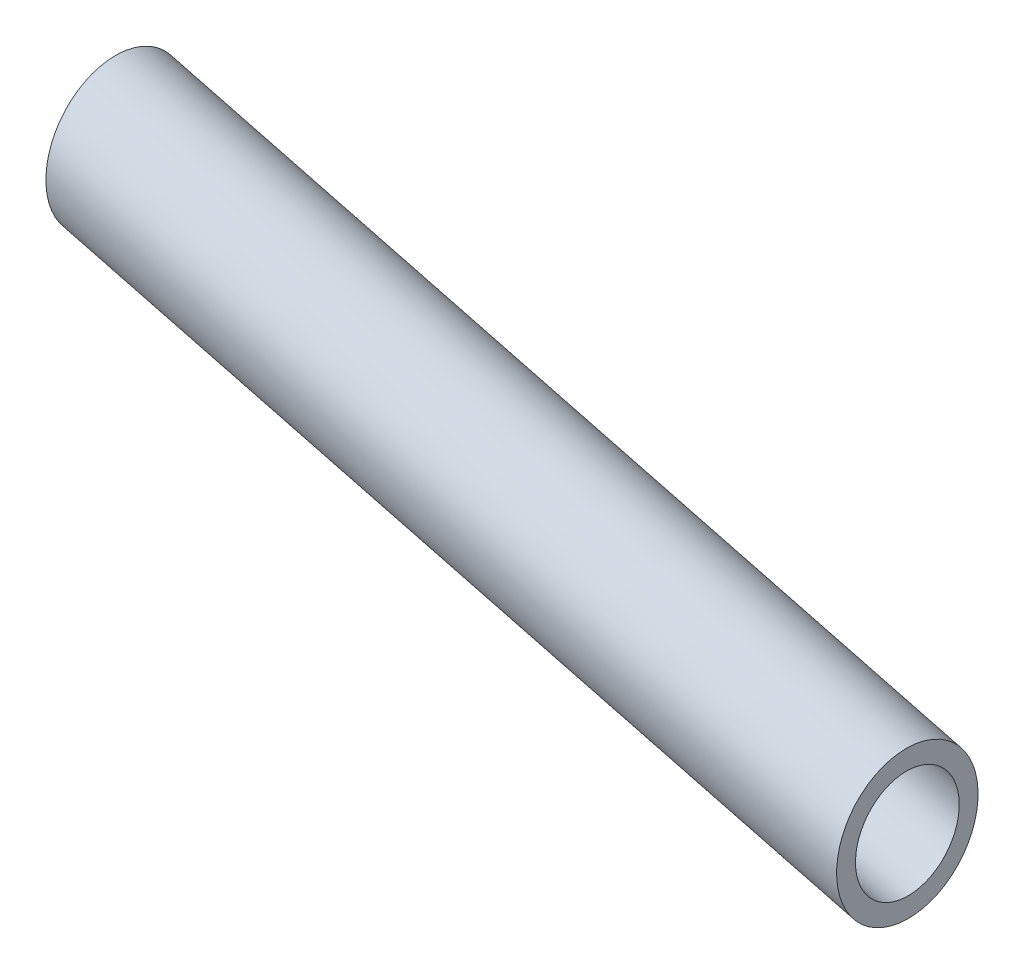
ISO-10303-21;
HEADER;
FILE_DESCRIPTION(('STEP AP214'),'2;1');
FILE_NAME('part.step','',(''),(''),'','','');
FILE_SCHEMA(('AUTOMOTIVE_DESIGN { 1 0 10303 214 1 1 1 1 }'));
ENDSEC;
DATA;
#1=APPLICATION_CONTEXT('core data for automotive mechanical design processes');
#2=APPLICATION_PROTOCOL_DEFINITION('international standard','automotive_design',2000,#1);
#3=PRODUCT_CONTEXT('',#1,'mechanical');
#4=PRODUCT('Part','Part','',(#3));
#5=PRODUCT_RELATED_PRODUCT_CATEGORY('part','',(#4));
#6=PRODUCT_DEFINITION_FORMATION('','',#4);
#7=PRODUCT_DEFINITION_CONTEXT('part definition',#1,'design');
#8=PRODUCT_DEFINITION('design','',#6,#7);
#9=PRODUCT_DEFINITION_SHAPE('','',#8);
#10=(LENGTH_UNIT() NAMED_UNIT(*) SI_UNIT(.MILLI.,.METRE.));
#11=(NAMED_UNIT(*) PLANE_ANGLE_UNIT() SI_UNIT($,.RADIAN.));
#12=(NAMED_UNIT(*) SI_UNIT($,.STERADIAN.) SOLID_ANGLE_UNIT());
#13=UNCERTAINTY_MEASURE_WITH_UNIT(LENGTH_MEASURE(1.E-05),#10,'distance_accuracy_value','');
#14=(GEOMETRIC_REPRESENTATION_CONTEXT(3) GLOBAL_UNCERTAINTY_ASSIGNED_CONTEXT((#13)) GLOBAL_UNIT_ASSIGNED_CONTEXT((#10,
#11,#12)) REPRESENTATION_CONTEXT('',''));
#15=CARTESIAN_POINT('',(0.,0.,0.));
#16=DIRECTION('',(0.,0.,1.));
#17=DIRECTION('',(1.,0.,0.));
#18=AXIS2_PLACEMENT_3D('',#15,#16,#17);
#19=CARTESIAN_POINT('',(20.7,22.164065639471,3.4109850966));
#20=DIRECTION('',(0.951034068730792,-0.305489587315356,-0.0470139570260758));
#21=DIRECTION('',(0.305827761696009,0.95208685537403,0.));
#22=AXIS2_PLACEMENT_3D('',#19,#20,#21);
#23=CYLINDRICAL_SURFACE('',#22,1.65);
#24=DIRECTION('',(0.951034068730915,-0.305489587314972,-0.0470139570260758));
#25=VECTOR('',#24,1.);
#26=CARTESIAN_POINT('',(21.204615806798,23.735008950838,3.4109850966));
#27=LINE('',#26,#25);
#28=CARTESIAN_POINT('',(25.7,22.291009090943,3.18875772723));
#29=VERTEX_POINT('',#28);
#30=CARTESIAN_POINT('',(49.7,14.581768868518,2.002328128413));
#31=VERTEX_POINT('',#30);
#32=EDGE_CURVE('E11',#29,#31,#27,.T.);
#33=ORIENTED_EDGE('',*,*,#32,.F.);
#34=CARTESIAN_POINT('',(25.7,20.557973926466,3.163812263513));
#35=DIRECTION('',(1.,0.,0.));
#36=DIRECTION('',(0.,-0.988364131080042,-0.152106358823007));
#37=AXIS2_PLACEMENT_3D('',#34,#35,#36);
#38=ELLIPSE('',#37,1.734953619697,1.65);
#39=EDGE_CURVE('E28',#29,#29,#38,.T.);
#40=ORIENTED_EDGE('',*,*,#39,.F.);
#41=ORIENTED_EDGE('',*,*,#32,.T.);
#42=CARTESIAN_POINT('',(49.7,12.848733704041,1.977382664695));
#43=DIRECTION('',(1.,0.,0.));
#44=DIRECTION('',(0.,-0.988364131080042,-0.152106358823007));
#45=AXIS2_PLACEMENT_3D('',#42,#43,#44);
#46=ELLIPSE('',#45,1.734953619697,1.65);
#47=EDGE_CURVE('E21',#31,#31,#46,.T.);
#48=ORIENTED_EDGE('',*,*,#47,.T.);
#49=EDGE_LOOP('',(#33,#40,#41,#48));
#50=FACE_BOUND('',#49,.T.);
#51=ADVANCED_FACE('F17',(#50),#23,.F.);
#52=CARTESIAN_POINT('',(25.7,-50.,-50.));
#53=DIRECTION('',(1.,0.,0.));
#54=DIRECTION('',(0.,1.,0.));
#55=AXIS2_PLACEMENT_3D('',#52,#53,#54);
#56=PLANE('',#55);
#57=ORIENTED_EDGE('',*,*,#39,.T.);
#58=EDGE_LOOP('',(#57));
#59=FACE_BOUND('',#58,.T.);
#60=CARTESIAN_POINT('',(25.7,20.557973926466,3.163812263513));
#61=DIRECTION('',(1.,0.,0.));
#62=DIRECTION('',(0.,-0.988364131080042,-0.152106358823007));
#63=AXIS2_PLACEMENT_3D('',#60,#61,#62);
#64=ELLIPSE('',#63,2.365845845041,2.25);
#65=CARTESIAN_POINT('',(25.7,22.921203696207,3.197828804945));
#66=VERTEX_POINT('',#65);
#67=EDGE_CURVE('E57',#66,#66,#64,.T.);
#68=ORIENTED_EDGE('',*,*,#67,.F.);
#69=EDGE_LOOP('',(#68));
#70=FACE_BOUND('',#69,.T.);
#71=ADVANCED_FACE('F19',(#59,#70),#56,.F.);
#72=CARTESIAN_POINT('',(49.7,-50.,-50.));
#73=DIRECTION('',(1.,0.,0.));
#74=DIRECTION('',(0.,1.,0.));
#75=AXIS2_PLACEMENT_3D('',#72,#73,#74);
#76=PLANE('',#75);
#77=ORIENTED_EDGE('',*,*,#47,.F.);
#78=EDGE_LOOP('',(#77));
#79=FACE_BOUND('',#78,.T.);
#80=CARTESIAN_POINT('',(49.7,12.848733704041,1.977382664695));
#81=DIRECTION('',(1.,0.,0.));
#82=DIRECTION('',(0.,-0.988364131080042,-0.152106358823007));
#83=AXIS2_PLACEMENT_3D('',#80,#81,#82);
#84=ELLIPSE('',#83,2.365845845041,2.25);
#85=CARTESIAN_POINT('',(49.7,15.211963473783,2.011399206128));
#86=VERTEX_POINT('',#85);
#87=EDGE_CURVE('E65',#86,#86,#84,.T.);
#88=ORIENTED_EDGE('',*,*,#87,.T.);
#89=EDGE_LOOP('',(#88));
#90=FACE_BOUND('',#89,.T.);
#91=ADVANCED_FACE('F74',(#79,#90),#76,.T.);
#92=CARTESIAN_POINT('',(20.7,22.164065639471,3.4109850966));
#93=DIRECTION('',(0.951034068730792,-0.305489587315356,-0.0470139570260758));
#94=DIRECTION('',(0.305827761696009,0.95208685537403,0.));
#95=AXIS2_PLACEMENT_3D('',#92,#93,#94);
#96=CYLINDRICAL_SURFACE('',#95,2.25);
#97=ORIENTED_EDGE('',*,*,#87,.F.);
#98=DIRECTION('',(0.951034068730915,-0.305489587314972,-0.0470139570260758));
#99=VECTOR('',#98,1.);
#100=CARTESIAN_POINT('',(21.388112463815,24.306261064063,3.4109850966));
#101=LINE('',#100,#99);
#102=EDGE_CURVE('E52',#66,#86,#101,.T.);
#103=ORIENTED_EDGE('',*,*,#102,.F.);
#104=ORIENTED_EDGE('',*,*,#67,.T.);
#105=ORIENTED_EDGE('',*,*,#102,.T.);
#106=EDGE_LOOP('',(#97,#103,#104,#105));
#107=FACE_BOUND('',#106,.T.);
#108=ADVANCED_FACE('F58',(#107),#96,.T.);
#109=CLOSED_SHELL('',(#51,#71,#91,#108));
#110=MANIFOLD_SOLID_BREP('B1',#109);
#111=ADVANCED_BREP_SHAPE_REPRESENTATION('',(#18,#110),#14);
#112=SHAPE_DEFINITION_REPRESENTATION(#9,#111);
ENDSEC;
END-ISO-10303-21;
